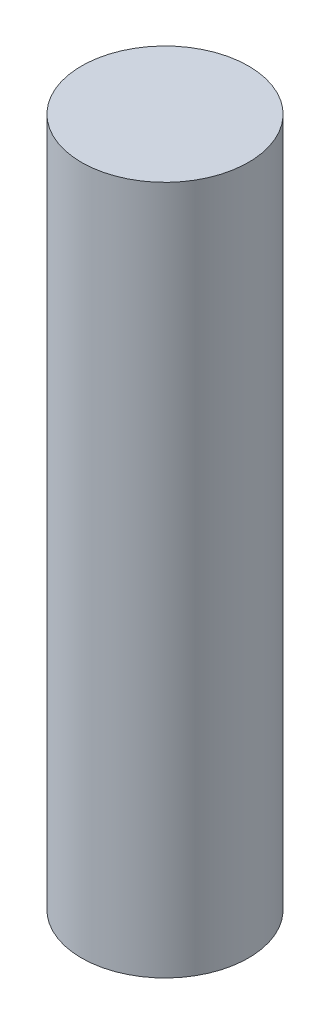
ISO-10303-21;
HEADER;
FILE_DESCRIPTION(('STEP AP214'),'2;1');
FILE_NAME('part.step','',(''),(''),'','','');
FILE_SCHEMA(('AUTOMOTIVE_DESIGN { 1 0 10303 214 1 1 1 1 }'));
ENDSEC;
DATA;
#1=APPLICATION_CONTEXT('core data for automotive mechanical design processes');
#2=APPLICATION_PROTOCOL_DEFINITION('international standard','automotive_design',2000,#1);
#3=PRODUCT_CONTEXT('',#1,'mechanical');
#4=PRODUCT('Part','Part','',(#3));
#5=PRODUCT_RELATED_PRODUCT_CATEGORY('part','',(#4));
#6=PRODUCT_DEFINITION_FORMATION('','',#4);
#7=PRODUCT_DEFINITION_CONTEXT('part definition',#1,'design');
#8=PRODUCT_DEFINITION('design','',#6,#7);
#9=PRODUCT_DEFINITION_SHAPE('','',#8);
#10=(LENGTH_UNIT() NAMED_UNIT(*) SI_UNIT(.MILLI.,.METRE.));
#11=(NAMED_UNIT(*) PLANE_ANGLE_UNIT() SI_UNIT($,.RADIAN.));
#12=(NAMED_UNIT(*) SI_UNIT($,.STERADIAN.) SOLID_ANGLE_UNIT());
#13=UNCERTAINTY_MEASURE_WITH_UNIT(LENGTH_MEASURE(1.E-05),#10,'distance_accuracy_value','');
#14=(GEOMETRIC_REPRESENTATION_CONTEXT(3) GLOBAL_UNCERTAINTY_ASSIGNED_CONTEXT((#13)) GLOBAL_UNIT_ASSIGNED_CONTEXT((#10,
#11,#12)) REPRESENTATION_CONTEXT('',''));
#15=CARTESIAN_POINT('',(0.,0.,0.));
#16=DIRECTION('',(0.,0.,1.));
#17=DIRECTION('',(1.,0.,0.));
#18=AXIS2_PLACEMENT_3D('',#15,#16,#17);
#19=CARTESIAN_POINT('',(0.,144.375,0.));
#20=DIRECTION('',(0.,-1.,0.));
#21=DIRECTION('',(0.,0.,-1.));
#22=AXIS2_PLACEMENT_3D('',#19,#20,#21);
#23=CYLINDRICAL_SURFACE('',#22,15.);
#24=CARTESIAN_POINT('',(0.,144.375,0.));
#25=DIRECTION('',(0.,1.,0.));
#26=DIRECTION('',(0.,0.,1.));
#27=AXIS2_PLACEMENT_3D('',#24,#25,#26);
#28=CIRCLE('',#27,15.);
#29=CARTESIAN_POINT('',(0.,144.375,15.));
#30=VERTEX_POINT('',#29);
#31=EDGE_CURVE('E11',#30,#30,#28,.T.);
#32=ORIENTED_EDGE('',*,*,#31,.F.);
#33=EDGE_LOOP('',(#32));
#34=FACE_BOUND('',#33,.T.);
#35=CARTESIAN_POINT('',(0.,20.625,0.));
#36=DIRECTION('',(0.,1.,0.));
#37=DIRECTION('',(0.,0.,1.));
#38=AXIS2_PLACEMENT_3D('',#35,#36,#37);
#39=CIRCLE('',#38,15.);
#40=CARTESIAN_POINT('',(0.,20.625,15.));
#41=VERTEX_POINT('',#40);
#42=EDGE_CURVE('E47',#41,#41,#39,.T.);
#43=ORIENTED_EDGE('',*,*,#42,.T.);
#44=EDGE_LOOP('',(#43));
#45=FACE_BOUND('',#44,.T.);
#46=ADVANCED_FACE('F46',(#34,#45),#23,.T.);
#47=CARTESIAN_POINT('',(0.,144.375,0.));
#48=DIRECTION('',(0.,1.,0.));
#49=DIRECTION('',(0.,0.,1.));
#50=AXIS2_PLACEMENT_3D('',#47,#48,#49);
#51=PLANE('',#50);
#52=ORIENTED_EDGE('',*,*,#31,.T.);
#53=EDGE_LOOP('',(#52));
#54=FACE_BOUND('',#53,.T.);
#55=ADVANCED_FACE('F62',(#54),#51,.T.);
#56=CARTESIAN_POINT('',(0.,20.625,0.));
#57=DIRECTION('',(0.,1.,0.));
#58=DIRECTION('',(0.,0.,1.));
#59=AXIS2_PLACEMENT_3D('',#56,#57,#58);
#60=PLANE('',#59);
#61=ORIENTED_EDGE('',*,*,#42,.F.);
#62=EDGE_LOOP('',(#61));
#63=FACE_BOUND('',#62,.T.);
#64=ADVANCED_FACE('F56',(#63),#60,.F.);
#65=CLOSED_SHELL('',(#46,#55,#64));
#66=MANIFOLD_SOLID_BREP('B2',#65);
#67=ADVANCED_BREP_SHAPE_REPRESENTATION('',(#18,#66),#14);
#68=SHAPE_DEFINITION_REPRESENTATION(#9,#67);
ENDSEC;
END-ISO-10303-21;
